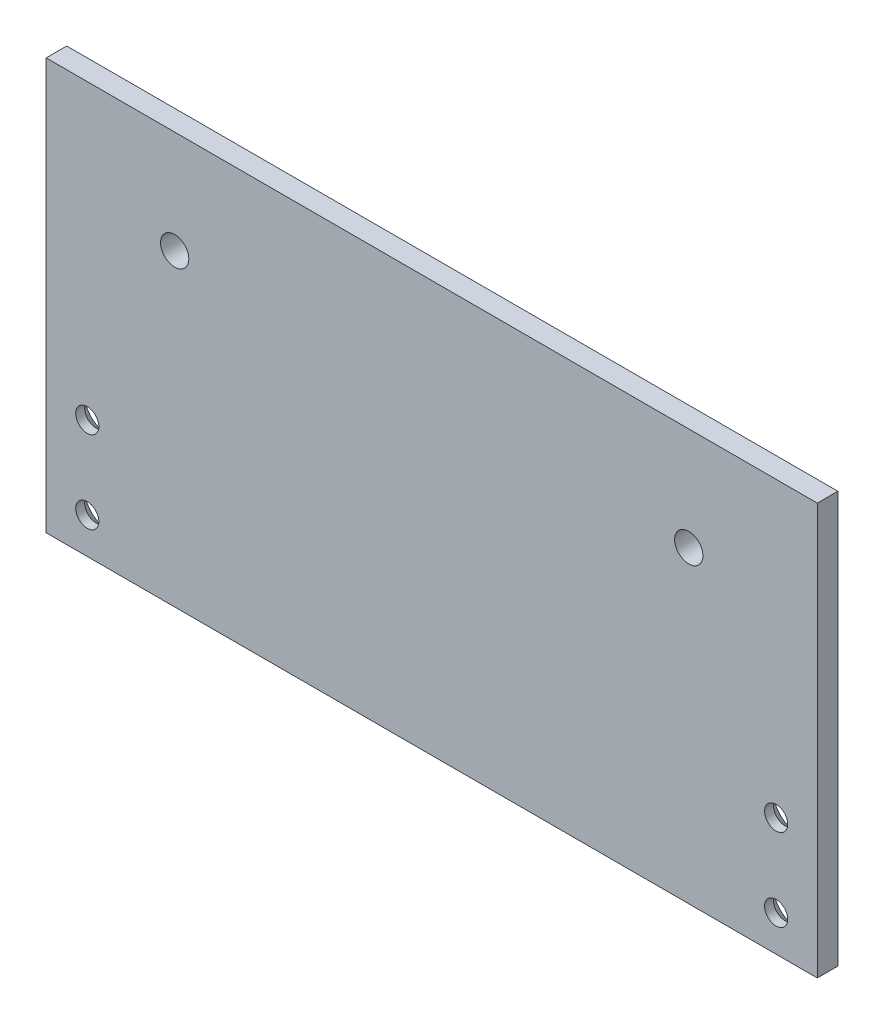
ISO-10303-21;
HEADER;
FILE_DESCRIPTION(('STEP AP214'),'2;1');
FILE_NAME('part.step','',(''),(''),'','','');
FILE_SCHEMA(('AUTOMOTIVE_DESIGN { 1 0 10303 214 1 1 1 1 }'));
ENDSEC;
DATA;
#1=APPLICATION_CONTEXT('core data for automotive mechanical design processes');
#2=APPLICATION_PROTOCOL_DEFINITION('international standard','automotive_design',2000,#1);
#3=PRODUCT_CONTEXT('',#1,'mechanical');
#4=PRODUCT('Part','Part','',(#3));
#5=PRODUCT_RELATED_PRODUCT_CATEGORY('part','',(#4));
#6=PRODUCT_DEFINITION_FORMATION('','',#4);
#7=PRODUCT_DEFINITION_CONTEXT('part definition',#1,'design');
#8=PRODUCT_DEFINITION('design','',#6,#7);
#9=PRODUCT_DEFINITION_SHAPE('','',#8);
#10=(LENGTH_UNIT() NAMED_UNIT(*) SI_UNIT(.MILLI.,.METRE.));
#11=(NAMED_UNIT(*) PLANE_ANGLE_UNIT() SI_UNIT($,.RADIAN.));
#12=(NAMED_UNIT(*) SI_UNIT($,.STERADIAN.) SOLID_ANGLE_UNIT());
#13=UNCERTAINTY_MEASURE_WITH_UNIT(LENGTH_MEASURE(1.E-05),#10,'distance_accuracy_value','');
#14=(GEOMETRIC_REPRESENTATION_CONTEXT(3) GLOBAL_UNCERTAINTY_ASSIGNED_CONTEXT((#13)) GLOBAL_UNIT_ASSIGNED_CONTEXT((#10,
#11,#12)) REPRESENTATION_CONTEXT('',''));
#15=CARTESIAN_POINT('',(0.,0.,0.));
#16=DIRECTION('',(0.,0.,1.));
#17=DIRECTION('',(1.,0.,0.));
#18=AXIS2_PLACEMENT_3D('',#15,#16,#17);
#19=CARTESIAN_POINT('',(8.,7.,0.0233999999750267));
#20=DIRECTION('',(0.,0.,-1.));
#21=DIRECTION('',(-1.,0.,0.));
#22=AXIS2_PLACEMENT_3D('',#19,#20,#21);
#23=CONICAL_SURFACE('',#22,4.49999999998863,0.785398163397448);
#24=CARTESIAN_POINT('',(8.,7.,0.0233999999563819));
#25=DIRECTION('',(0.,0.,-1.));
#26=DIRECTION('',(-1.,0.,0.));
#27=AXIS2_PLACEMENT_3D('',#24,#25,#26);
#28=CIRCLE('',#27,4.50000000000728);
#29=CARTESIAN_POINT('',(3.49999999999272,7.,0.0233999999563819));
#30=VERTEX_POINT('',#29);
#31=EDGE_CURVE('E19',#30,#30,#28,.T.);
#32=ORIENTED_EDGE('',*,*,#31,.T.);
#33=EDGE_LOOP('',(#32));
#34=FACE_BOUND('',#33,.T.);
#35=CARTESIAN_POINT('',(8.,7.,2.2734));
#36=DIRECTION('',(0.,0.,1.));
#37=DIRECTION('',(1.,0.,0.));
#38=AXIS2_PLACEMENT_3D('',#35,#36,#37);
#39=CIRCLE('',#38,2.25);
#40=CARTESIAN_POINT('',(10.25,7.,2.2734));
#41=VERTEX_POINT('',#40);
#42=EDGE_CURVE('E284',#41,#41,#39,.T.);
#43=ORIENTED_EDGE('',*,*,#42,.T.);
#44=EDGE_LOOP('',(#43));
#45=FACE_BOUND('',#44,.T.);
#46=ADVANCED_FACE('F16',(#34,#45),#23,.F.);
#47=CARTESIAN_POINT('',(8.,23.,0.0233999999750267));
#48=DIRECTION('',(0.,0.,-1.));
#49=DIRECTION('',(-1.,0.,0.));
#50=AXIS2_PLACEMENT_3D('',#47,#48,#49);
#51=CONICAL_SURFACE('',#50,4.49999999998863,0.785398163397448);
#52=CARTESIAN_POINT('',(8.,23.,0.0233999999563819));
#53=DIRECTION('',(0.,0.,-1.));
#54=DIRECTION('',(-1.,0.,0.));
#55=AXIS2_PLACEMENT_3D('',#52,#53,#54);
#56=CIRCLE('',#55,4.50000000000728);
#57=CARTESIAN_POINT('',(3.49999999999272,23.,0.0233999999563819));
#58=VERTEX_POINT('',#57);
#59=EDGE_CURVE('E110',#58,#58,#56,.T.);
#60=ORIENTED_EDGE('',*,*,#59,.T.);
#61=EDGE_LOOP('',(#60));
#62=FACE_BOUND('',#61,.T.);
#63=CARTESIAN_POINT('',(8.,23.,2.2734));
#64=DIRECTION('',(0.,0.,1.));
#65=DIRECTION('',(1.,0.,0.));
#66=AXIS2_PLACEMENT_3D('',#63,#64,#65);
#67=CIRCLE('',#66,2.25);
#68=CARTESIAN_POINT('',(10.25,23.,2.2734));
#69=VERTEX_POINT('',#68);
#70=EDGE_CURVE('E281',#69,#69,#67,.T.);
#71=ORIENTED_EDGE('',*,*,#70,.T.);
#72=EDGE_LOOP('',(#71));
#73=FACE_BOUND('',#72,.T.);
#74=ADVANCED_FACE('F259',(#62,#73),#51,.F.);
#75=CARTESIAN_POINT('',(142.,7.,0.0234000000318701));
#76=DIRECTION('',(0.,0.,-1.));
#77=DIRECTION('',(0.,1.,0.));
#78=AXIS2_PLACEMENT_3D('',#75,#76,#77);
#79=CONICAL_SURFACE('',#78,4.49999999994632,0.785398163397448);
#80=CARTESIAN_POINT('',(142.,7.,0.0233999999709189));
#81=DIRECTION('',(0.,0.,-1.));
#82=DIRECTION('',(0.,1.,0.));
#83=AXIS2_PLACEMENT_3D('',#80,#81,#82);
#84=CIRCLE('',#83,4.50000000000728);
#85=CARTESIAN_POINT('',(142.,11.5000000000073,0.0233999999709189));
#86=VERTEX_POINT('',#85);
#87=EDGE_CURVE('E108',#86,#86,#84,.T.);
#88=ORIENTED_EDGE('',*,*,#87,.T.);
#89=EDGE_LOOP('',(#88));
#90=FACE_BOUND('',#89,.T.);
#91=CARTESIAN_POINT('',(142.,7.,2.2734));
#92=DIRECTION('',(0.,0.,1.));
#93=DIRECTION('',(1.,0.,0.));
#94=AXIS2_PLACEMENT_3D('',#91,#92,#93);
#95=CIRCLE('',#94,2.25);
#96=CARTESIAN_POINT('',(144.25,7.,2.2734));
#97=VERTEX_POINT('',#96);
#98=EDGE_CURVE('E283',#97,#97,#95,.T.);
#99=ORIENTED_EDGE('',*,*,#98,.T.);
#100=EDGE_LOOP('',(#99));
#101=FACE_BOUND('',#100,.T.);
#102=ADVANCED_FACE('F129',(#90,#101),#79,.F.);
#103=CARTESIAN_POINT('',(142.,23.,0.0234000000318701));
#104=DIRECTION('',(0.,0.,-1.));
#105=DIRECTION('',(0.,1.,0.));
#106=AXIS2_PLACEMENT_3D('',#103,#104,#105);
#107=CONICAL_SURFACE('',#106,4.49999999994632,0.785398163397448);
#108=CARTESIAN_POINT('',(142.,23.,0.0233999999709189));
#109=DIRECTION('',(0.,0.,-1.));
#110=DIRECTION('',(0.,1.,0.));
#111=AXIS2_PLACEMENT_3D('',#108,#109,#110);
#112=CIRCLE('',#111,4.50000000000728);
#113=CARTESIAN_POINT('',(142.,27.5000000000073,0.0233999999709189));
#114=VERTEX_POINT('',#113);
#115=EDGE_CURVE('E72',#114,#114,#112,.T.);
#116=ORIENTED_EDGE('',*,*,#115,.T.);
#117=EDGE_LOOP('',(#116));
#118=FACE_BOUND('',#117,.T.);
#119=CARTESIAN_POINT('',(142.,23.,2.2734));
#120=DIRECTION('',(0.,0.,1.));
#121=DIRECTION('',(1.,0.,0.));
#122=AXIS2_PLACEMENT_3D('',#119,#120,#121);
#123=CIRCLE('',#122,2.25);
#124=CARTESIAN_POINT('',(144.25,23.,2.2734));
#125=VERTEX_POINT('',#124);
#126=EDGE_CURVE('E105',#125,#125,#123,.T.);
#127=ORIENTED_EDGE('',*,*,#126,.T.);
#128=EDGE_LOOP('',(#127));
#129=FACE_BOUND('',#128,.T.);
#130=ADVANCED_FACE('F120',(#118,#129),#107,.F.);
#131=CARTESIAN_POINT('',(0.,0.,0.02340000000004));
#132=DIRECTION('',(0.,0.,1.));
#133=DIRECTION('',(1.,0.,0.));
#134=AXIS2_PLACEMENT_3D('',#131,#132,#133);
#135=PLANE('',#134);
#136=CARTESIAN_POINT('',(125.,60.,0.02340000000004));
#137=DIRECTION('',(0.,0.,1.));
#138=DIRECTION('',(1.,0.,0.));
#139=AXIS2_PLACEMENT_3D('',#136,#137,#138);
#140=CIRCLE('',#139,2.75);
#141=CARTESIAN_POINT('',(127.75,60.,0.02340000000004));
#142=VERTEX_POINT('',#141);
#143=EDGE_CURVE('E98',#142,#142,#140,.T.);
#144=ORIENTED_EDGE('',*,*,#143,.T.);
#145=EDGE_LOOP('',(#144));
#146=FACE_BOUND('',#145,.T.);
#147=CARTESIAN_POINT('',(25.,60.,0.02340000000004));
#148=DIRECTION('',(0.,0.,1.));
#149=DIRECTION('',(1.,0.,0.));
#150=AXIS2_PLACEMENT_3D('',#147,#148,#149);
#151=CIRCLE('',#150,2.75);
#152=CARTESIAN_POINT('',(27.75,60.,0.02340000000004));
#153=VERTEX_POINT('',#152);
#154=EDGE_CURVE('E102',#153,#153,#151,.T.);
#155=ORIENTED_EDGE('',*,*,#154,.T.);
#156=EDGE_LOOP('',(#155));
#157=FACE_BOUND('',#156,.T.);
#158=ORIENTED_EDGE('',*,*,#115,.F.);
#159=EDGE_LOOP('',(#158));
#160=FACE_BOUND('',#159,.T.);
#161=ORIENTED_EDGE('',*,*,#87,.F.);
#162=EDGE_LOOP('',(#161));
#163=FACE_BOUND('',#162,.T.);
#164=ORIENTED_EDGE('',*,*,#59,.F.);
#165=EDGE_LOOP('',(#164));
#166=FACE_BOUND('',#165,.T.);
#167=ORIENTED_EDGE('',*,*,#31,.F.);
#168=EDGE_LOOP('',(#167));
#169=FACE_BOUND('',#168,.T.);
#170=DIRECTION('',(0.,1.,0.));
#171=VECTOR('',#170,1.);
#172=CARTESIAN_POINT('',(150.,0.,0.02340000000004));
#173=LINE('',#172,#171);
#174=CARTESIAN_POINT('',(150.,0.,0.02340000000004));
#175=VERTEX_POINT('',#174);
#176=CARTESIAN_POINT('',(150.,80.,0.02340000000004));
#177=VERTEX_POINT('',#176);
#178=EDGE_CURVE('E62',#175,#177,#173,.T.);
#179=ORIENTED_EDGE('',*,*,#178,.F.);
#180=DIRECTION('',(1.,0.,0.));
#181=VECTOR('',#180,1.);
#182=CARTESIAN_POINT('',(0.,0.,0.02340000000004));
#183=LINE('',#182,#181);
#184=CARTESIAN_POINT('',(0.,0.,0.02340000000004));
#185=VERTEX_POINT('',#184);
#186=EDGE_CURVE('E55',#175,#185,#183,.F.);
#187=ORIENTED_EDGE('',*,*,#186,.T.);
#188=DIRECTION('',(0.,1.,0.));
#189=VECTOR('',#188,1.);
#190=CARTESIAN_POINT('',(0.,0.,0.02340000000004));
#191=LINE('',#190,#189);
#192=CARTESIAN_POINT('',(0.,80.,0.02340000000004));
#193=VERTEX_POINT('',#192);
#194=EDGE_CURVE('E60',#185,#193,#191,.T.);
#195=ORIENTED_EDGE('',*,*,#194,.T.);
#196=DIRECTION('',(1.,0.,0.));
#197=VECTOR('',#196,1.);
#198=CARTESIAN_POINT('',(0.,80.,0.02340000000004));
#199=LINE('',#198,#197);
#200=EDGE_CURVE('E294',#177,#193,#199,.F.);
#201=ORIENTED_EDGE('',*,*,#200,.F.);
#202=EDGE_LOOP('',(#179,#187,#195,#201));
#203=FACE_BOUND('',#202,.T.);
#204=ADVANCED_FACE('F59',(#146,#157,#160,#163,#166,#169,#203),#135,.F.);
#205=CARTESIAN_POINT('',(0.,0.,0.02340000000004));
#206=DIRECTION('',(1.,0.,0.));
#207=DIRECTION('',(0.,0.,-1.));
#208=AXIS2_PLACEMENT_3D('',#205,#206,#207);
#209=PLANE('',#208);
#210=DIRECTION('',(0.,0.,1.));
#211=VECTOR('',#210,1.);
#212=CARTESIAN_POINT('',(0.,80.,0.02340000000004));
#213=LINE('',#212,#211);
#214=CARTESIAN_POINT('',(0.,80.,4.0234));
#215=VERTEX_POINT('',#214);
#216=EDGE_CURVE('E70',#193,#215,#213,.T.);
#217=ORIENTED_EDGE('',*,*,#216,.F.);
#218=ORIENTED_EDGE('',*,*,#194,.F.);
#219=DIRECTION('',(0.,0.,1.));
#220=VECTOR('',#219,1.);
#221=CARTESIAN_POINT('',(0.,0.,0.02340000000004));
#222=LINE('',#221,#220);
#223=CARTESIAN_POINT('',(0.,0.,4.0234));
#224=VERTEX_POINT('',#223);
#225=EDGE_CURVE('E64',#185,#224,#222,.T.);
#226=ORIENTED_EDGE('',*,*,#225,.T.);
#227=DIRECTION('',(0.,1.,0.));
#228=VECTOR('',#227,1.);
#229=CARTESIAN_POINT('',(0.,0.,4.0234));
#230=LINE('',#229,#228);
#231=EDGE_CURVE('E101',#215,#224,#230,.F.);
#232=ORIENTED_EDGE('',*,*,#231,.F.);
#233=EDGE_LOOP('',(#217,#218,#226,#232));
#234=FACE_BOUND('',#233,.T.);
#235=ADVANCED_FACE('F67',(#234),#209,.F.);
#236=CARTESIAN_POINT('',(0.,0.,0.02340000000004));
#237=DIRECTION('',(0.,1.,0.));
#238=DIRECTION('',(0.,0.,1.));
#239=AXIS2_PLACEMENT_3D('',#236,#237,#238);
#240=PLANE('',#239);
#241=DIRECTION('',(1.,0.,0.));
#242=VECTOR('',#241,1.);
#243=CARTESIAN_POINT('',(0.,0.,4.0234));
#244=LINE('',#243,#242);
#245=CARTESIAN_POINT('',(150.,0.,4.0234));
#246=VERTEX_POINT('',#245);
#247=EDGE_CURVE('E76',#224,#246,#244,.T.);
#248=ORIENTED_EDGE('',*,*,#247,.F.);
#249=ORIENTED_EDGE('',*,*,#225,.F.);
#250=ORIENTED_EDGE('',*,*,#186,.F.);
#251=DIRECTION('',(0.,0.,-1.));
#252=VECTOR('',#251,1.);
#253=CARTESIAN_POINT('',(150.,0.,0.02340000000004));
#254=LINE('',#253,#252);
#255=EDGE_CURVE('E78',#246,#175,#254,.T.);
#256=ORIENTED_EDGE('',*,*,#255,.F.);
#257=EDGE_LOOP('',(#248,#249,#250,#256));
#258=FACE_BOUND('',#257,.T.);
#259=ADVANCED_FACE('F74',(#258),#240,.F.);
#260=CARTESIAN_POINT('',(150.,0.,0.02340000000004));
#261=DIRECTION('',(1.,0.,0.));
#262=DIRECTION('',(0.,0.,-1.));
#263=AXIS2_PLACEMENT_3D('',#260,#261,#262);
#264=PLANE('',#263);
#265=DIRECTION('',(0.,0.,1.));
#266=VECTOR('',#265,1.);
#267=CARTESIAN_POINT('',(150.,80.,0.02340000000004));
#268=LINE('',#267,#266);
#269=CARTESIAN_POINT('',(150.,80.,4.0234));
#270=VERTEX_POINT('',#269);
#271=EDGE_CURVE('E34',#270,#177,#268,.F.);
#272=ORIENTED_EDGE('',*,*,#271,.F.);
#273=DIRECTION('',(0.,1.,0.));
#274=VECTOR('',#273,1.);
#275=CARTESIAN_POINT('',(150.,0.,4.0234));
#276=LINE('',#275,#274);
#277=EDGE_CURVE('E298',#246,#270,#276,.T.);
#278=ORIENTED_EDGE('',*,*,#277,.F.);
#279=ORIENTED_EDGE('',*,*,#255,.T.);
#280=ORIENTED_EDGE('',*,*,#178,.T.);
#281=EDGE_LOOP('',(#272,#278,#279,#280));
#282=FACE_BOUND('',#281,.T.);
#283=ADVANCED_FACE('F168',(#282),#264,.T.);
#284=CARTESIAN_POINT('',(0.,80.,0.02340000000004));
#285=DIRECTION('',(0.,1.,0.));
#286=DIRECTION('',(0.,0.,1.));
#287=AXIS2_PLACEMENT_3D('',#284,#285,#286);
#288=PLANE('',#287);
#289=DIRECTION('',(1.,0.,0.));
#290=VECTOR('',#289,1.);
#291=CARTESIAN_POINT('',(0.,80.,4.0234));
#292=LINE('',#291,#290);
#293=EDGE_CURVE('E97',#270,#215,#292,.F.);
#294=ORIENTED_EDGE('',*,*,#293,.F.);
#295=ORIENTED_EDGE('',*,*,#271,.T.);
#296=ORIENTED_EDGE('',*,*,#200,.T.);
#297=ORIENTED_EDGE('',*,*,#216,.T.);
#298=EDGE_LOOP('',(#294,#295,#296,#297));
#299=FACE_BOUND('',#298,.T.);
#300=ADVANCED_FACE('F164',(#299),#288,.T.);
#301=CARTESIAN_POINT('',(8.,7.,0.02340000000004));
#302=DIRECTION('',(0.,0.,1.));
#303=DIRECTION('',(1.,0.,0.));
#304=AXIS2_PLACEMENT_3D('',#301,#302,#303);
#305=CYLINDRICAL_SURFACE('',#304,2.25);
#306=CARTESIAN_POINT('',(8.,7.,4.0234));
#307=DIRECTION('',(0.,0.,1.));
#308=DIRECTION('',(1.,0.,0.));
#309=AXIS2_PLACEMENT_3D('',#306,#307,#308);
#310=CIRCLE('',#309,2.25);
#311=CARTESIAN_POINT('',(10.25,7.,4.0234));
#312=VERTEX_POINT('',#311);
#313=EDGE_CURVE('E94',#312,#312,#310,.F.);
#314=ORIENTED_EDGE('',*,*,#313,.F.);
#315=EDGE_LOOP('',(#314));
#316=FACE_BOUND('',#315,.T.);
#317=ORIENTED_EDGE('',*,*,#42,.F.);
#318=EDGE_LOOP('',(#317));
#319=FACE_BOUND('',#318,.T.);
#320=ADVANCED_FACE('F160',(#316,#319),#305,.F.);
#321=CARTESIAN_POINT('',(8.,23.,0.02340000000004));
#322=DIRECTION('',(0.,0.,1.));
#323=DIRECTION('',(1.,0.,0.));
#324=AXIS2_PLACEMENT_3D('',#321,#322,#323);
#325=CYLINDRICAL_SURFACE('',#324,2.25);
#326=CARTESIAN_POINT('',(8.,23.,4.0234));
#327=DIRECTION('',(0.,0.,1.));
#328=DIRECTION('',(1.,0.,0.));
#329=AXIS2_PLACEMENT_3D('',#326,#327,#328);
#330=CIRCLE('',#329,2.25);
#331=CARTESIAN_POINT('',(10.25,23.,4.0234));
#332=VERTEX_POINT('',#331);
#333=EDGE_CURVE('E91',#332,#332,#330,.F.);
#334=ORIENTED_EDGE('',*,*,#333,.F.);
#335=EDGE_LOOP('',(#334));
#336=FACE_BOUND('',#335,.T.);
#337=ORIENTED_EDGE('',*,*,#70,.F.);
#338=EDGE_LOOP('',(#337));
#339=FACE_BOUND('',#338,.T.);
#340=ADVANCED_FACE('F156',(#336,#339),#325,.F.);
#341=CARTESIAN_POINT('',(142.,7.,0.02340000000004));
#342=DIRECTION('',(0.,0.,1.));
#343=DIRECTION('',(1.,0.,0.));
#344=AXIS2_PLACEMENT_3D('',#341,#342,#343);
#345=CYLINDRICAL_SURFACE('',#344,2.25);
#346=CARTESIAN_POINT('',(142.,7.,4.0234));
#347=DIRECTION('',(0.,0.,1.));
#348=DIRECTION('',(1.,0.,0.));
#349=AXIS2_PLACEMENT_3D('',#346,#347,#348);
#350=CIRCLE('',#349,2.25);
#351=CARTESIAN_POINT('',(144.25,7.,4.0234));
#352=VERTEX_POINT('',#351);
#353=EDGE_CURVE('E88',#352,#352,#350,.F.);
#354=ORIENTED_EDGE('',*,*,#353,.F.);
#355=EDGE_LOOP('',(#354));
#356=FACE_BOUND('',#355,.T.);
#357=ORIENTED_EDGE('',*,*,#98,.F.);
#358=EDGE_LOOP('',(#357));
#359=FACE_BOUND('',#358,.T.);
#360=ADVANCED_FACE('F152',(#356,#359),#345,.F.);
#361=CARTESIAN_POINT('',(142.,23.,0.02340000000004));
#362=DIRECTION('',(0.,0.,1.));
#363=DIRECTION('',(1.,0.,0.));
#364=AXIS2_PLACEMENT_3D('',#361,#362,#363);
#365=CYLINDRICAL_SURFACE('',#364,2.25);
#366=CARTESIAN_POINT('',(142.,23.,4.0234));
#367=DIRECTION('',(0.,0.,1.));
#368=DIRECTION('',(1.,0.,0.));
#369=AXIS2_PLACEMENT_3D('',#366,#367,#368);
#370=CIRCLE('',#369,2.25);
#371=CARTESIAN_POINT('',(144.25,23.,4.0234));
#372=VERTEX_POINT('',#371);
#373=EDGE_CURVE('E85',#372,#372,#370,.F.);
#374=ORIENTED_EDGE('',*,*,#373,.F.);
#375=EDGE_LOOP('',(#374));
#376=FACE_BOUND('',#375,.T.);
#377=ORIENTED_EDGE('',*,*,#126,.F.);
#378=EDGE_LOOP('',(#377));
#379=FACE_BOUND('',#378,.T.);
#380=ADVANCED_FACE('F148',(#376,#379),#365,.F.);
#381=CARTESIAN_POINT('',(25.,60.,0.02340000000004));
#382=DIRECTION('',(0.,0.,1.));
#383=DIRECTION('',(1.,0.,0.));
#384=AXIS2_PLACEMENT_3D('',#381,#382,#383);
#385=CYLINDRICAL_SURFACE('',#384,2.75);
#386=ORIENTED_EDGE('',*,*,#154,.F.);
#387=EDGE_LOOP('',(#386));
#388=FACE_BOUND('',#387,.T.);
#389=CARTESIAN_POINT('',(25.,60.,4.0234));
#390=DIRECTION('',(0.,0.,1.));
#391=DIRECTION('',(1.,0.,0.));
#392=AXIS2_PLACEMENT_3D('',#389,#390,#391);
#393=CIRCLE('',#392,2.75);
#394=CARTESIAN_POINT('',(27.75,60.,4.0234));
#395=VERTEX_POINT('',#394);
#396=EDGE_CURVE('E25',#395,#395,#393,.F.);
#397=ORIENTED_EDGE('',*,*,#396,.F.);
#398=EDGE_LOOP('',(#397));
#399=FACE_BOUND('',#398,.T.);
#400=ADVANCED_FACE('F141',(#388,#399),#385,.F.);
#401=CARTESIAN_POINT('',(125.,60.,0.02340000000004));
#402=DIRECTION('',(0.,0.,1.));
#403=DIRECTION('',(1.,0.,0.));
#404=AXIS2_PLACEMENT_3D('',#401,#402,#403);
#405=CYLINDRICAL_SURFACE('',#404,2.75);
#406=ORIENTED_EDGE('',*,*,#143,.F.);
#407=EDGE_LOOP('',(#406));
#408=FACE_BOUND('',#407,.T.);
#409=CARTESIAN_POINT('',(125.,60.,4.0234));
#410=DIRECTION('',(0.,0.,1.));
#411=DIRECTION('',(1.,0.,0.));
#412=AXIS2_PLACEMENT_3D('',#409,#410,#411);
#413=CIRCLE('',#412,2.75);
#414=CARTESIAN_POINT('',(127.75,60.,4.0234));
#415=VERTEX_POINT('',#414);
#416=EDGE_CURVE('E11',#415,#415,#413,.F.);
#417=ORIENTED_EDGE('',*,*,#416,.F.);
#418=EDGE_LOOP('',(#417));
#419=FACE_BOUND('',#418,.T.);
#420=ADVANCED_FACE('F135',(#408,#419),#405,.F.);
#421=CARTESIAN_POINT('',(0.,0.,4.0234));
#422=DIRECTION('',(0.,0.,1.));
#423=DIRECTION('',(1.,0.,0.));
#424=AXIS2_PLACEMENT_3D('',#421,#422,#423);
#425=PLANE('',#424);
#426=ORIENTED_EDGE('',*,*,#416,.T.);
#427=EDGE_LOOP('',(#426));
#428=FACE_BOUND('',#427,.T.);
#429=ORIENTED_EDGE('',*,*,#396,.T.);
#430=EDGE_LOOP('',(#429));
#431=FACE_BOUND('',#430,.T.);
#432=ORIENTED_EDGE('',*,*,#373,.T.);
#433=EDGE_LOOP('',(#432));
#434=FACE_BOUND('',#433,.T.);
#435=ORIENTED_EDGE('',*,*,#353,.T.);
#436=EDGE_LOOP('',(#435));
#437=FACE_BOUND('',#436,.T.);
#438=ORIENTED_EDGE('',*,*,#333,.T.);
#439=EDGE_LOOP('',(#438));
#440=FACE_BOUND('',#439,.T.);
#441=ORIENTED_EDGE('',*,*,#313,.T.);
#442=EDGE_LOOP('',(#441));
#443=FACE_BOUND('',#442,.T.);
#444=ORIENTED_EDGE('',*,*,#277,.T.);
#445=ORIENTED_EDGE('',*,*,#293,.T.);
#446=ORIENTED_EDGE('',*,*,#231,.T.);
#447=ORIENTED_EDGE('',*,*,#247,.T.);
#448=EDGE_LOOP('',(#444,#445,#446,#447));
#449=FACE_BOUND('',#448,.T.);
#450=ADVANCED_FACE('F133',(#428,#431,#434,#437,#440,#443,#449),#425,.T.);
#451=CLOSED_SHELL('',(#46,#74,#102,#130,#204,#235,#259,#283,#300,#320,#340,#360,#380,#400,#420,#450));
#452=MANIFOLD_SOLID_BREP('B1',#451);
#453=ADVANCED_BREP_SHAPE_REPRESENTATION('',(#18,#452),#14);
#454=SHAPE_DEFINITION_REPRESENTATION(#9,#453);
ENDSEC;
END-ISO-10303-21;
